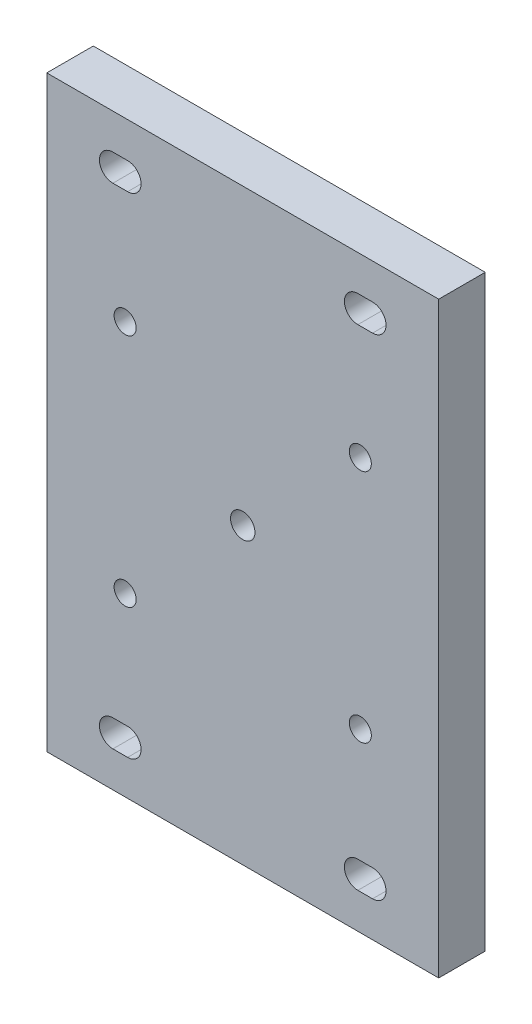
ISO-10303-21;
HEADER;
FILE_DESCRIPTION(('STEP AP214'),'2;1');
FILE_NAME('part.step','',(''),(''),'','','');
FILE_SCHEMA(('AUTOMOTIVE_DESIGN { 1 0 10303 214 1 1 1 1 }'));
ENDSEC;
DATA;
#1=APPLICATION_CONTEXT('core data for automotive mechanical design processes');
#2=APPLICATION_PROTOCOL_DEFINITION('international standard','automotive_design',2000,#1);
#3=PRODUCT_CONTEXT('',#1,'mechanical');
#4=PRODUCT('Part','Part','',(#3));
#5=PRODUCT_RELATED_PRODUCT_CATEGORY('part','',(#4));
#6=PRODUCT_DEFINITION_FORMATION('','',#4);
#7=PRODUCT_DEFINITION_CONTEXT('part definition',#1,'design');
#8=PRODUCT_DEFINITION('design','',#6,#7);
#9=PRODUCT_DEFINITION_SHAPE('','',#8);
#10=(LENGTH_UNIT() NAMED_UNIT(*) SI_UNIT(.MILLI.,.METRE.));
#11=(NAMED_UNIT(*) PLANE_ANGLE_UNIT() SI_UNIT($,.RADIAN.));
#12=(NAMED_UNIT(*) SI_UNIT($,.STERADIAN.) SOLID_ANGLE_UNIT());
#13=UNCERTAINTY_MEASURE_WITH_UNIT(LENGTH_MEASURE(1.E-05),#10,'distance_accuracy_value','');
#14=(GEOMETRIC_REPRESENTATION_CONTEXT(3) GLOBAL_UNCERTAINTY_ASSIGNED_CONTEXT((#13)) GLOBAL_UNIT_ASSIGNED_CONTEXT((#10,
#11,#12)) REPRESENTATION_CONTEXT('',''));
#15=CARTESIAN_POINT('',(0.,0.,0.));
#16=DIRECTION('',(0.,0.,1.));
#17=DIRECTION('',(1.,0.,0.));
#18=AXIS2_PLACEMENT_3D('',#15,#16,#17);
#19=CARTESIAN_POINT('',(24.,-24.,0.));
#20=DIRECTION('',(0.,0.,-1.));
#21=DIRECTION('',(-1.,0.,0.));
#22=AXIS2_PLACEMENT_3D('',#19,#20,#21);
#23=CYLINDRICAL_SURFACE('',#22,4.);
#24=CARTESIAN_POINT('',(24.,-24.,4.4));
#25=DIRECTION('',(0.,0.,-1.));
#26=DIRECTION('',(-1.,0.,0.));
#27=AXIS2_PLACEMENT_3D('',#24,#25,#26);
#28=CIRCLE('',#27,4.);
#29=CARTESIAN_POINT('',(20.,-24.,4.4));
#30=VERTEX_POINT('',#29);
#31=EDGE_CURVE('E19',#30,#30,#28,.F.);
#32=ORIENTED_EDGE('',*,*,#31,.T.);
#33=EDGE_LOOP('',(#32));
#34=FACE_BOUND('',#33,.T.);
#35=CARTESIAN_POINT('',(24.,-24.,0.));
#36=DIRECTION('',(0.,0.,-1.));
#37=DIRECTION('',(-1.,0.,0.));
#38=AXIS2_PLACEMENT_3D('',#35,#36,#37);
#39=CIRCLE('',#38,4.);
#40=CARTESIAN_POINT('',(20.,-24.,0.));
#41=VERTEX_POINT('',#40);
#42=EDGE_CURVE('E286',#41,#41,#39,.T.);
#43=ORIENTED_EDGE('',*,*,#42,.T.);
#44=EDGE_LOOP('',(#43));
#45=FACE_BOUND('',#44,.T.);
#46=ADVANCED_FACE('F16',(#34,#45),#23,.F.);
#47=CARTESIAN_POINT('',(-24.,-24.,0.));
#48=DIRECTION('',(0.,0.,-1.));
#49=DIRECTION('',(-1.,0.,0.));
#50=AXIS2_PLACEMENT_3D('',#47,#48,#49);
#51=CYLINDRICAL_SURFACE('',#50,4.);
#52=CARTESIAN_POINT('',(-24.,-24.,4.4));
#53=DIRECTION('',(0.,0.,-1.));
#54=DIRECTION('',(-1.,0.,0.));
#55=AXIS2_PLACEMENT_3D('',#52,#53,#54);
#56=CIRCLE('',#55,4.);
#57=CARTESIAN_POINT('',(-28.,-24.,4.4));
#58=VERTEX_POINT('',#57);
#59=EDGE_CURVE('E294',#58,#58,#56,.F.);
#60=ORIENTED_EDGE('',*,*,#59,.T.);
#61=EDGE_LOOP('',(#60));
#62=FACE_BOUND('',#61,.T.);
#63=CARTESIAN_POINT('',(-24.,-24.,0.));
#64=DIRECTION('',(0.,0.,-1.));
#65=DIRECTION('',(-1.,0.,0.));
#66=AXIS2_PLACEMENT_3D('',#63,#64,#65);
#67=CIRCLE('',#66,4.);
#68=CARTESIAN_POINT('',(-28.,-24.,0.));
#69=VERTEX_POINT('',#68);
#70=EDGE_CURVE('E283',#69,#69,#67,.T.);
#71=ORIENTED_EDGE('',*,*,#70,.T.);
#72=EDGE_LOOP('',(#71));
#73=FACE_BOUND('',#72,.T.);
#74=ADVANCED_FACE('F516',(#62,#73),#51,.F.);
#75=CARTESIAN_POINT('',(24.,24.,0.));
#76=DIRECTION('',(0.,0.,-1.));
#77=DIRECTION('',(-1.,0.,0.));
#78=AXIS2_PLACEMENT_3D('',#75,#76,#77);
#79=CYLINDRICAL_SURFACE('',#78,4.);
#80=CARTESIAN_POINT('',(24.,24.,4.4));
#81=DIRECTION('',(0.,0.,-1.));
#82=DIRECTION('',(-1.,0.,0.));
#83=AXIS2_PLACEMENT_3D('',#80,#81,#82);
#84=CIRCLE('',#83,4.);
#85=CARTESIAN_POINT('',(20.,24.,4.4));
#86=VERTEX_POINT('',#85);
#87=EDGE_CURVE('E292',#86,#86,#84,.F.);
#88=ORIENTED_EDGE('',*,*,#87,.T.);
#89=EDGE_LOOP('',(#88));
#90=FACE_BOUND('',#89,.T.);
#91=CARTESIAN_POINT('',(24.,24.,0.));
#92=DIRECTION('',(0.,0.,-1.));
#93=DIRECTION('',(-1.,0.,0.));
#94=AXIS2_PLACEMENT_3D('',#91,#92,#93);
#95=CIRCLE('',#94,4.);
#96=CARTESIAN_POINT('',(20.,24.,0.));
#97=VERTEX_POINT('',#96);
#98=EDGE_CURVE('E280',#97,#97,#95,.T.);
#99=ORIENTED_EDGE('',*,*,#98,.T.);
#100=EDGE_LOOP('',(#99));
#101=FACE_BOUND('',#100,.T.);
#102=ADVANCED_FACE('F513',(#90,#101),#79,.F.);
#103=CARTESIAN_POINT('',(-24.,24.,0.));
#104=DIRECTION('',(0.,0.,-1.));
#105=DIRECTION('',(-1.,0.,0.));
#106=AXIS2_PLACEMENT_3D('',#103,#104,#105);
#107=CYLINDRICAL_SURFACE('',#106,4.);
#108=CARTESIAN_POINT('',(-24.,24.,4.4));
#109=DIRECTION('',(0.,0.,-1.));
#110=DIRECTION('',(-1.,0.,0.));
#111=AXIS2_PLACEMENT_3D('',#108,#109,#110);
#112=CIRCLE('',#111,4.);
#113=CARTESIAN_POINT('',(-28.,24.,4.4));
#114=VERTEX_POINT('',#113);
#115=EDGE_CURVE('E289',#114,#114,#112,.F.);
#116=ORIENTED_EDGE('',*,*,#115,.T.);
#117=EDGE_LOOP('',(#116));
#118=FACE_BOUND('',#117,.T.);
#119=CARTESIAN_POINT('',(-24.,24.,0.));
#120=DIRECTION('',(0.,0.,-1.));
#121=DIRECTION('',(-1.,0.,0.));
#122=AXIS2_PLACEMENT_3D('',#119,#120,#121);
#123=CIRCLE('',#122,4.);
#124=CARTESIAN_POINT('',(-28.,24.,0.));
#125=VERTEX_POINT('',#124);
#126=EDGE_CURVE('E168',#125,#125,#123,.T.);
#127=ORIENTED_EDGE('',*,*,#126,.T.);
#128=EDGE_LOOP('',(#127));
#129=FACE_BOUND('',#128,.T.);
#130=ADVANCED_FACE('F307',(#118,#129),#107,.F.);
#131=CARTESIAN_POINT('',(26.25,-24.,4.4));
#132=DIRECTION('',(0.,0.,1.));
#133=DIRECTION('',(1.,0.,0.));
#134=AXIS2_PLACEMENT_3D('',#131,#132,#133);
#135=PLANE('',#134);
#136=ORIENTED_EDGE('',*,*,#31,.F.);
#137=EDGE_LOOP('',(#136));
#138=FACE_BOUND('',#137,.T.);
#139=CARTESIAN_POINT('',(24.,-24.,4.4));
#140=DIRECTION('',(0.,0.,-1.));
#141=DIRECTION('',(-1.,0.,0.));
#142=AXIS2_PLACEMENT_3D('',#139,#140,#141);
#143=CIRCLE('',#142,2.25);
#144=CARTESIAN_POINT('',(21.75,-24.,4.4));
#145=VERTEX_POINT('',#144);
#146=EDGE_CURVE('E262',#145,#145,#143,.F.);
#147=ORIENTED_EDGE('',*,*,#146,.T.);
#148=EDGE_LOOP('',(#147));
#149=FACE_BOUND('',#148,.T.);
#150=ADVANCED_FACE('F303',(#138,#149),#135,.F.);
#151=CARTESIAN_POINT('',(-21.75,-24.,4.4));
#152=DIRECTION('',(0.,0.,1.));
#153=DIRECTION('',(1.,0.,0.));
#154=AXIS2_PLACEMENT_3D('',#151,#152,#153);
#155=PLANE('',#154);
#156=ORIENTED_EDGE('',*,*,#59,.F.);
#157=EDGE_LOOP('',(#156));
#158=FACE_BOUND('',#157,.T.);
#159=CARTESIAN_POINT('',(-24.,-24.,4.4));
#160=DIRECTION('',(0.,0.,-1.));
#161=DIRECTION('',(-1.,0.,0.));
#162=AXIS2_PLACEMENT_3D('',#159,#160,#161);
#163=CIRCLE('',#162,2.25);
#164=CARTESIAN_POINT('',(-26.25,-24.,4.4));
#165=VERTEX_POINT('',#164);
#166=EDGE_CURVE('E259',#165,#165,#163,.F.);
#167=ORIENTED_EDGE('',*,*,#166,.T.);
#168=EDGE_LOOP('',(#167));
#169=FACE_BOUND('',#168,.T.);
#170=ADVANCED_FACE('F306',(#158,#169),#155,.F.);
#171=CARTESIAN_POINT('',(26.25,24.,4.4));
#172=DIRECTION('',(0.,0.,1.));
#173=DIRECTION('',(1.,0.,0.));
#174=AXIS2_PLACEMENT_3D('',#171,#172,#173);
#175=PLANE('',#174);
#176=ORIENTED_EDGE('',*,*,#87,.F.);
#177=EDGE_LOOP('',(#176));
#178=FACE_BOUND('',#177,.T.);
#179=CARTESIAN_POINT('',(24.,24.,4.4));
#180=DIRECTION('',(0.,0.,-1.));
#181=DIRECTION('',(-1.,0.,0.));
#182=AXIS2_PLACEMENT_3D('',#179,#180,#181);
#183=CIRCLE('',#182,2.25);
#184=CARTESIAN_POINT('',(21.75,24.,4.4));
#185=VERTEX_POINT('',#184);
#186=EDGE_CURVE('E256',#185,#185,#183,.F.);
#187=ORIENTED_EDGE('',*,*,#186,.T.);
#188=EDGE_LOOP('',(#187));
#189=FACE_BOUND('',#188,.T.);
#190=ADVANCED_FACE('F503',(#178,#189),#175,.F.);
#191=CARTESIAN_POINT('',(-21.75,24.,4.4));
#192=DIRECTION('',(0.,0.,1.));
#193=DIRECTION('',(1.,0.,0.));
#194=AXIS2_PLACEMENT_3D('',#191,#192,#193);
#195=PLANE('',#194);
#196=ORIENTED_EDGE('',*,*,#115,.F.);
#197=EDGE_LOOP('',(#196));
#198=FACE_BOUND('',#197,.T.);
#199=CARTESIAN_POINT('',(-24.,24.,4.4));
#200=DIRECTION('',(0.,0.,-1.));
#201=DIRECTION('',(-1.,0.,0.));
#202=AXIS2_PLACEMENT_3D('',#199,#200,#201);
#203=CIRCLE('',#202,2.25);
#204=CARTESIAN_POINT('',(-26.25,24.,4.4));
#205=VERTEX_POINT('',#204);
#206=EDGE_CURVE('E253',#205,#205,#203,.F.);
#207=ORIENTED_EDGE('',*,*,#206,.T.);
#208=EDGE_LOOP('',(#207));
#209=FACE_BOUND('',#208,.T.);
#210=ADVANCED_FACE('F500',(#198,#209),#195,.F.);
#211=CARTESIAN_POINT('',(-40.,-60.,0.));
#212=DIRECTION('',(0.,0.,1.));
#213=DIRECTION('',(1.,0.,0.));
#214=AXIS2_PLACEMENT_3D('',#211,#212,#213);
#215=PLANE('',#214);
#216=DIRECTION('',(1.,0.,0.));
#217=VECTOR('',#216,1.);
#218=CARTESIAN_POINT('',(40.,60.,0.));
#219=LINE('',#218,#217);
#220=CARTESIAN_POINT('',(-40.,60.,0.));
#221=VERTEX_POINT('',#220);
#222=CARTESIAN_POINT('',(40.,60.,0.));
#223=VERTEX_POINT('',#222);
#224=EDGE_CURVE('E248',#221,#223,#219,.T.);
#225=ORIENTED_EDGE('',*,*,#224,.T.);
#226=DIRECTION('',(0.,1.,0.));
#227=VECTOR('',#226,1.);
#228=CARTESIAN_POINT('',(40.,-60.,0.));
#229=LINE('',#228,#227);
#230=CARTESIAN_POINT('',(40.,-60.,0.));
#231=VERTEX_POINT('',#230);
#232=EDGE_CURVE('E361',#223,#231,#229,.F.);
#233=ORIENTED_EDGE('',*,*,#232,.T.);
#234=DIRECTION('',(1.,0.,0.));
#235=VECTOR('',#234,1.);
#236=CARTESIAN_POINT('',(-40.,-60.,0.));
#237=LINE('',#236,#235);
#238=CARTESIAN_POINT('',(-40.,-60.,0.));
#239=VERTEX_POINT('',#238);
#240=EDGE_CURVE('E366',#231,#239,#237,.F.);
#241=ORIENTED_EDGE('',*,*,#240,.T.);
#242=DIRECTION('',(0.,1.,0.));
#243=VECTOR('',#242,1.);
#244=CARTESIAN_POINT('',(-40.,60.,0.));
#245=LINE('',#244,#243);
#246=EDGE_CURVE('E252',#239,#221,#245,.T.);
#247=ORIENTED_EDGE('',*,*,#246,.T.);
#248=EDGE_LOOP('',(#225,#233,#241,#247));
#249=FACE_BOUND('',#248,.T.);
#250=CARTESIAN_POINT('',(0.,0.,0.));
#251=DIRECTION('',(0.,0.,-1.));
#252=DIRECTION('',(-1.,0.,0.));
#253=AXIS2_PLACEMENT_3D('',#250,#251,#252);
#254=CIRCLE('',#253,2.495);
#255=CARTESIAN_POINT('',(-2.495,0.,0.));
#256=VERTEX_POINT('',#255);
#257=EDGE_CURVE('E249',#256,#256,#254,.F.);
#258=ORIENTED_EDGE('',*,*,#257,.T.);
#259=EDGE_LOOP('',(#258));
#260=FACE_BOUND('',#259,.T.);
#261=ORIENTED_EDGE('',*,*,#126,.F.);
#262=EDGE_LOOP('',(#261));
#263=FACE_BOUND('',#262,.T.);
#264=ORIENTED_EDGE('',*,*,#98,.F.);
#265=EDGE_LOOP('',(#264));
#266=FACE_BOUND('',#265,.T.);
#267=ORIENTED_EDGE('',*,*,#70,.F.);
#268=EDGE_LOOP('',(#267));
#269=FACE_BOUND('',#268,.T.);
#270=ORIENTED_EDGE('',*,*,#42,.F.);
#271=EDGE_LOOP('',(#270));
#272=FACE_BOUND('',#271,.T.);
#273=CARTESIAN_POINT('',(-26.5,50.,0.));
#274=DIRECTION('',(0.,0.,1.));
#275=DIRECTION('',(1.,0.,0.));
#276=AXIS2_PLACEMENT_3D('',#273,#274,#275);
#277=CIRCLE('',#276,2.75);
#278=CARTESIAN_POINT('',(-26.5,52.75,0.));
#279=VERTEX_POINT('',#278);
#280=CARTESIAN_POINT('',(-26.5,47.25,0.));
#281=VERTEX_POINT('',#280);
#282=EDGE_CURVE('E186',#279,#281,#277,.T.);
#283=ORIENTED_EDGE('',*,*,#282,.T.);
#284=DIRECTION('',(1.,0.,0.));
#285=VECTOR('',#284,1.);
#286=CARTESIAN_POINT('',(-26.5,47.25,0.));
#287=LINE('',#286,#285);
#288=CARTESIAN_POINT('',(-23.5,47.25,0.));
#289=VERTEX_POINT('',#288);
#290=EDGE_CURVE('E179',#281,#289,#287,.T.);
#291=ORIENTED_EDGE('',*,*,#290,.T.);
#292=CARTESIAN_POINT('',(-23.5,50.,0.));
#293=DIRECTION('',(0.,0.,1.));
#294=DIRECTION('',(1.,0.,0.));
#295=AXIS2_PLACEMENT_3D('',#292,#293,#294);
#296=CIRCLE('',#295,2.75);
#297=CARTESIAN_POINT('',(-23.5,52.75,0.));
#298=VERTEX_POINT('',#297);
#299=EDGE_CURVE('E265',#289,#298,#296,.T.);
#300=ORIENTED_EDGE('',*,*,#299,.T.);
#301=DIRECTION('',(1.,0.,0.));
#302=VECTOR('',#301,1.);
#303=CARTESIAN_POINT('',(-26.5,52.75,0.));
#304=LINE('',#303,#302);
#305=EDGE_CURVE('E183',#298,#279,#304,.F.);
#306=ORIENTED_EDGE('',*,*,#305,.T.);
#307=EDGE_LOOP('',(#283,#291,#300,#306));
#308=FACE_BOUND('',#307,.T.);
#309=CARTESIAN_POINT('',(23.5,50.,0.));
#310=DIRECTION('',(0.,0.,1.));
#311=DIRECTION('',(1.,0.,0.));
#312=AXIS2_PLACEMENT_3D('',#309,#310,#311);
#313=CIRCLE('',#312,2.75);
#314=CARTESIAN_POINT('',(23.5,52.75,0.));
#315=VERTEX_POINT('',#314);
#316=CARTESIAN_POINT('',(23.5,47.25,0.));
#317=VERTEX_POINT('',#316);
#318=EDGE_CURVE('E194',#315,#317,#313,.T.);
#319=ORIENTED_EDGE('',*,*,#318,.T.);
#320=DIRECTION('',(1.,0.,0.));
#321=VECTOR('',#320,1.);
#322=CARTESIAN_POINT('',(23.5,47.25,0.));
#323=LINE('',#322,#321);
#324=CARTESIAN_POINT('',(26.5,47.25,0.));
#325=VERTEX_POINT('',#324);
#326=EDGE_CURVE('E187',#317,#325,#323,.T.);
#327=ORIENTED_EDGE('',*,*,#326,.T.);
#328=CARTESIAN_POINT('',(26.5,50.,0.));
#329=DIRECTION('',(0.,0.,1.));
#330=DIRECTION('',(1.,0.,0.));
#331=AXIS2_PLACEMENT_3D('',#328,#329,#330);
#332=CIRCLE('',#331,2.75);
#333=CARTESIAN_POINT('',(26.5,52.75,0.));
#334=VERTEX_POINT('',#333);
#335=EDGE_CURVE('E269',#325,#334,#332,.T.);
#336=ORIENTED_EDGE('',*,*,#335,.T.);
#337=DIRECTION('',(1.,0.,0.));
#338=VECTOR('',#337,1.);
#339=CARTESIAN_POINT('',(23.5,52.75,0.));
#340=LINE('',#339,#338);
#341=EDGE_CURVE('E191',#334,#315,#340,.F.);
#342=ORIENTED_EDGE('',*,*,#341,.T.);
#343=EDGE_LOOP('',(#319,#327,#336,#342));
#344=FACE_BOUND('',#343,.T.);
#345=CARTESIAN_POINT('',(-26.5,-50.,0.));
#346=DIRECTION('',(0.,0.,1.));
#347=DIRECTION('',(1.,0.,0.));
#348=AXIS2_PLACEMENT_3D('',#345,#346,#347);
#349=CIRCLE('',#348,2.75);
#350=CARTESIAN_POINT('',(-26.5,-47.25,0.));
#351=VERTEX_POINT('',#350);
#352=CARTESIAN_POINT('',(-26.5,-52.75,0.));
#353=VERTEX_POINT('',#352);
#354=EDGE_CURVE('E202',#351,#353,#349,.T.);
#355=ORIENTED_EDGE('',*,*,#354,.T.);
#356=DIRECTION('',(1.,0.,0.));
#357=VECTOR('',#356,1.);
#358=CARTESIAN_POINT('',(-26.5,-52.75,0.));
#359=LINE('',#358,#357);
#360=CARTESIAN_POINT('',(-23.5,-52.75,0.));
#361=VERTEX_POINT('',#360);
#362=EDGE_CURVE('E195',#353,#361,#359,.T.);
#363=ORIENTED_EDGE('',*,*,#362,.T.);
#364=CARTESIAN_POINT('',(-23.5,-50.,0.));
#365=DIRECTION('',(0.,0.,1.));
#366=DIRECTION('',(1.,0.,0.));
#367=AXIS2_PLACEMENT_3D('',#364,#365,#366);
#368=CIRCLE('',#367,2.75);
#369=CARTESIAN_POINT('',(-23.5,-47.25,0.));
#370=VERTEX_POINT('',#369);
#371=EDGE_CURVE('E273',#361,#370,#368,.T.);
#372=ORIENTED_EDGE('',*,*,#371,.T.);
#373=DIRECTION('',(1.,0.,0.));
#374=VECTOR('',#373,1.);
#375=CARTESIAN_POINT('',(-26.5,-47.25,0.));
#376=LINE('',#375,#374);
#377=EDGE_CURVE('E199',#370,#351,#376,.F.);
#378=ORIENTED_EDGE('',*,*,#377,.T.);
#379=EDGE_LOOP('',(#355,#363,#372,#378));
#380=FACE_BOUND('',#379,.T.);
#381=CARTESIAN_POINT('',(23.5,-50.,0.));
#382=DIRECTION('',(0.,0.,1.));
#383=DIRECTION('',(1.,0.,0.));
#384=AXIS2_PLACEMENT_3D('',#381,#382,#383);
#385=CIRCLE('',#384,2.75);
#386=CARTESIAN_POINT('',(23.5,-47.25,0.));
#387=VERTEX_POINT('',#386);
#388=CARTESIAN_POINT('',(23.5,-52.75,0.));
#389=VERTEX_POINT('',#388);
#390=EDGE_CURVE('E153',#387,#389,#385,.T.);
#391=ORIENTED_EDGE('',*,*,#390,.T.);
#392=DIRECTION('',(1.,0.,0.));
#393=VECTOR('',#392,1.);
#394=CARTESIAN_POINT('',(23.5,-52.75,0.));
#395=LINE('',#394,#393);
#396=CARTESIAN_POINT('',(26.5,-52.75,0.));
#397=VERTEX_POINT('',#396);
#398=EDGE_CURVE('E203',#389,#397,#395,.T.);
#399=ORIENTED_EDGE('',*,*,#398,.T.);
#400=CARTESIAN_POINT('',(26.5,-50.,0.));
#401=DIRECTION('',(0.,0.,1.));
#402=DIRECTION('',(1.,0.,0.));
#403=AXIS2_PLACEMENT_3D('',#400,#401,#402);
#404=CIRCLE('',#403,2.75);
#405=CARTESIAN_POINT('',(26.5,-47.25,0.));
#406=VERTEX_POINT('',#405);
#407=EDGE_CURVE('E156',#397,#406,#404,.T.);
#408=ORIENTED_EDGE('',*,*,#407,.T.);
#409=DIRECTION('',(1.,0.,0.));
#410=VECTOR('',#409,1.);
#411=CARTESIAN_POINT('',(23.5,-47.25,0.));
#412=LINE('',#411,#410);
#413=EDGE_CURVE('E150',#406,#387,#412,.F.);
#414=ORIENTED_EDGE('',*,*,#413,.T.);
#415=EDGE_LOOP('',(#391,#399,#408,#414));
#416=FACE_BOUND('',#415,.T.);
#417=ADVANCED_FACE('F152',(#249,#260,#263,#266,#269,#272,#308,#344,#380,#416),#215,.F.);
#418=CARTESIAN_POINT('',(23.5,-50.,0.));
#419=DIRECTION('',(0.,0.,1.));
#420=DIRECTION('',(1.,0.,0.));
#421=AXIS2_PLACEMENT_3D('',#418,#419,#420);
#422=CYLINDRICAL_SURFACE('',#421,2.75);
#423=DIRECTION('',(0.,0.,-1.));
#424=VECTOR('',#423,1.);
#425=CARTESIAN_POINT('',(23.5,-52.75,0.));
#426=LINE('',#425,#424);
#427=CARTESIAN_POINT('',(23.5,-52.75,9.5));
#428=VERTEX_POINT('',#427);
#429=EDGE_CURVE('E166',#428,#389,#426,.T.);
#430=ORIENTED_EDGE('',*,*,#429,.T.);
#431=ORIENTED_EDGE('',*,*,#390,.F.);
#432=DIRECTION('',(0.,0.,1.));
#433=VECTOR('',#432,1.);
#434=CARTESIAN_POINT('',(23.5,-47.25,0.));
#435=LINE('',#434,#433);
#436=CARTESIAN_POINT('',(23.5,-47.25,9.5));
#437=VERTEX_POINT('',#436);
#438=EDGE_CURVE('E160',#387,#437,#435,.T.);
#439=ORIENTED_EDGE('',*,*,#438,.T.);
#440=CARTESIAN_POINT('',(23.5,-50.,9.5));
#441=DIRECTION('',(0.,0.,1.));
#442=DIRECTION('',(1.,0.,0.));
#443=AXIS2_PLACEMENT_3D('',#440,#441,#442);
#444=CIRCLE('',#443,2.75);
#445=EDGE_CURVE('E246',#428,#437,#444,.F.);
#446=ORIENTED_EDGE('',*,*,#445,.F.);
#447=EDGE_LOOP('',(#430,#431,#439,#446));
#448=FACE_BOUND('',#447,.T.);
#449=ADVANCED_FACE('F163',(#448),#422,.F.);
#450=CARTESIAN_POINT('',(23.5,-47.25,0.));
#451=DIRECTION('',(0.,1.,0.));
#452=DIRECTION('',(0.,0.,1.));
#453=AXIS2_PLACEMENT_3D('',#450,#451,#452);
#454=PLANE('',#453);
#455=ORIENTED_EDGE('',*,*,#438,.F.);
#456=ORIENTED_EDGE('',*,*,#413,.F.);
#457=DIRECTION('',(0.,0.,1.));
#458=VECTOR('',#457,1.);
#459=CARTESIAN_POINT('',(26.5,-47.25,0.));
#460=LINE('',#459,#458);
#461=CARTESIAN_POINT('',(26.5,-47.25,9.5));
#462=VERTEX_POINT('',#461);
#463=EDGE_CURVE('E174',#406,#462,#460,.T.);
#464=ORIENTED_EDGE('',*,*,#463,.T.);
#465=DIRECTION('',(1.,0.,0.));
#466=VECTOR('',#465,1.);
#467=CARTESIAN_POINT('',(-40.,-47.25,9.5));
#468=LINE('',#467,#466);
#469=EDGE_CURVE('E172',#437,#462,#468,.T.);
#470=ORIENTED_EDGE('',*,*,#469,.F.);
#471=EDGE_LOOP('',(#455,#456,#464,#470));
#472=FACE_BOUND('',#471,.T.);
#473=ADVANCED_FACE('F170',(#472),#454,.F.);
#474=CARTESIAN_POINT('',(26.5,-50.,0.));
#475=DIRECTION('',(0.,0.,1.));
#476=DIRECTION('',(1.,0.,0.));
#477=AXIS2_PLACEMENT_3D('',#474,#475,#476);
#478=CYLINDRICAL_SURFACE('',#477,2.75);
#479=ORIENTED_EDGE('',*,*,#407,.F.);
#480=DIRECTION('',(0.,0.,-1.));
#481=VECTOR('',#480,1.);
#482=CARTESIAN_POINT('',(26.5,-52.75,0.));
#483=LINE('',#482,#481);
#484=CARTESIAN_POINT('',(26.5,-52.75,9.5));
#485=VERTEX_POINT('',#484);
#486=EDGE_CURVE('E204',#397,#485,#483,.F.);
#487=ORIENTED_EDGE('',*,*,#486,.T.);
#488=CARTESIAN_POINT('',(26.5,-50.,9.5));
#489=DIRECTION('',(0.,0.,1.));
#490=DIRECTION('',(1.,0.,0.));
#491=AXIS2_PLACEMENT_3D('',#488,#489,#490);
#492=CIRCLE('',#491,2.75);
#493=EDGE_CURVE('E244',#462,#485,#492,.F.);
#494=ORIENTED_EDGE('',*,*,#493,.F.);
#495=ORIENTED_EDGE('',*,*,#463,.F.);
#496=EDGE_LOOP('',(#479,#487,#494,#495));
#497=FACE_BOUND('',#496,.T.);
#498=ADVANCED_FACE('F346',(#497),#478,.F.);
#499=CARTESIAN_POINT('',(23.5,-52.75,0.));
#500=DIRECTION('',(0.,-1.,0.));
#501=DIRECTION('',(0.,0.,-1.));
#502=AXIS2_PLACEMENT_3D('',#499,#500,#501);
#503=PLANE('',#502);
#504=ORIENTED_EDGE('',*,*,#486,.F.);
#505=ORIENTED_EDGE('',*,*,#398,.F.);
#506=ORIENTED_EDGE('',*,*,#429,.F.);
#507=DIRECTION('',(1.,0.,0.));
#508=VECTOR('',#507,1.);
#509=CARTESIAN_POINT('',(-40.,-52.75,9.5));
#510=LINE('',#509,#508);
#511=EDGE_CURVE('E243',#485,#428,#510,.F.);
#512=ORIENTED_EDGE('',*,*,#511,.F.);
#513=EDGE_LOOP('',(#504,#505,#506,#512));
#514=FACE_BOUND('',#513,.T.);
#515=ADVANCED_FACE('F349',(#514),#503,.F.);
#516=CARTESIAN_POINT('',(-26.5,-50.,0.));
#517=DIRECTION('',(0.,0.,1.));
#518=DIRECTION('',(1.,0.,0.));
#519=AXIS2_PLACEMENT_3D('',#516,#517,#518);
#520=CYLINDRICAL_SURFACE('',#519,2.75);
#521=DIRECTION('',(0.,0.,-1.));
#522=VECTOR('',#521,1.);
#523=CARTESIAN_POINT('',(-26.5,-52.75,0.));
#524=LINE('',#523,#522);
#525=CARTESIAN_POINT('',(-26.5,-52.75,9.5));
#526=VERTEX_POINT('',#525);
#527=EDGE_CURVE('E198',#526,#353,#524,.T.);
#528=ORIENTED_EDGE('',*,*,#527,.T.);
#529=ORIENTED_EDGE('',*,*,#354,.F.);
#530=DIRECTION('',(0.,0.,1.));
#531=VECTOR('',#530,1.);
#532=CARTESIAN_POINT('',(-26.5,-47.25,0.));
#533=LINE('',#532,#531);
#534=CARTESIAN_POINT('',(-26.5,-47.25,9.5));
#535=VERTEX_POINT('',#534);
#536=EDGE_CURVE('E201',#351,#535,#533,.T.);
#537=ORIENTED_EDGE('',*,*,#536,.T.);
#538=CARTESIAN_POINT('',(-26.5,-50.,9.5));
#539=DIRECTION('',(0.,0.,1.));
#540=DIRECTION('',(1.,0.,0.));
#541=AXIS2_PLACEMENT_3D('',#538,#539,#540);
#542=CIRCLE('',#541,2.75);
#543=EDGE_CURVE('E240',#526,#535,#542,.F.);
#544=ORIENTED_EDGE('',*,*,#543,.F.);
#545=EDGE_LOOP('',(#528,#529,#537,#544));
#546=FACE_BOUND('',#545,.T.);
#547=ADVANCED_FACE('F390',(#546),#520,.F.);
#548=CARTESIAN_POINT('',(-26.5,-47.25,0.));
#549=DIRECTION('',(0.,1.,0.));
#550=DIRECTION('',(0.,0.,1.));
#551=AXIS2_PLACEMENT_3D('',#548,#549,#550);
#552=PLANE('',#551);
#553=ORIENTED_EDGE('',*,*,#536,.F.);
#554=ORIENTED_EDGE('',*,*,#377,.F.);
#555=DIRECTION('',(0.,0.,1.));
#556=VECTOR('',#555,1.);
#557=CARTESIAN_POINT('',(-23.5,-47.25,0.));
#558=LINE('',#557,#556);
#559=CARTESIAN_POINT('',(-23.5,-47.25,9.5));
#560=VERTEX_POINT('',#559);
#561=EDGE_CURVE('E275',#370,#560,#558,.T.);
#562=ORIENTED_EDGE('',*,*,#561,.T.);
#563=DIRECTION('',(1.,0.,0.));
#564=VECTOR('',#563,1.);
#565=CARTESIAN_POINT('',(-40.,-47.25,9.5));
#566=LINE('',#565,#564);
#567=EDGE_CURVE('E239',#535,#560,#566,.T.);
#568=ORIENTED_EDGE('',*,*,#567,.F.);
#569=EDGE_LOOP('',(#553,#554,#562,#568));
#570=FACE_BOUND('',#569,.T.);
#571=ADVANCED_FACE('F394',(#570),#552,.F.);
#572=CARTESIAN_POINT('',(-23.5,-50.,0.));
#573=DIRECTION('',(0.,0.,1.));
#574=DIRECTION('',(1.,0.,0.));
#575=AXIS2_PLACEMENT_3D('',#572,#573,#574);
#576=CYLINDRICAL_SURFACE('',#575,2.75);
#577=ORIENTED_EDGE('',*,*,#371,.F.);
#578=DIRECTION('',(0.,0.,-1.));
#579=VECTOR('',#578,1.);
#580=CARTESIAN_POINT('',(-23.5,-52.75,0.));
#581=LINE('',#580,#579);
#582=CARTESIAN_POINT('',(-23.5,-52.75,9.5));
#583=VERTEX_POINT('',#582);
#584=EDGE_CURVE('E197',#361,#583,#581,.F.);
#585=ORIENTED_EDGE('',*,*,#584,.T.);
#586=CARTESIAN_POINT('',(-23.5,-50.,9.5));
#587=DIRECTION('',(0.,0.,1.));
#588=DIRECTION('',(1.,0.,0.));
#589=AXIS2_PLACEMENT_3D('',#586,#587,#588);
#590=CIRCLE('',#589,2.75);
#591=EDGE_CURVE('E237',#560,#583,#590,.F.);
#592=ORIENTED_EDGE('',*,*,#591,.F.);
#593=ORIENTED_EDGE('',*,*,#561,.F.);
#594=EDGE_LOOP('',(#577,#585,#592,#593));
#595=FACE_BOUND('',#594,.T.);
#596=ADVANCED_FACE('F482',(#595),#576,.F.);
#597=CARTESIAN_POINT('',(-26.5,-52.75,0.));
#598=DIRECTION('',(0.,-1.,0.));
#599=DIRECTION('',(0.,0.,-1.));
#600=AXIS2_PLACEMENT_3D('',#597,#598,#599);
#601=PLANE('',#600);
#602=ORIENTED_EDGE('',*,*,#584,.F.);
#603=ORIENTED_EDGE('',*,*,#362,.F.);
#604=ORIENTED_EDGE('',*,*,#527,.F.);
#605=DIRECTION('',(1.,0.,0.));
#606=VECTOR('',#605,1.);
#607=CARTESIAN_POINT('',(-40.,-52.75,9.5));
#608=LINE('',#607,#606);
#609=EDGE_CURVE('E236',#583,#526,#608,.F.);
#610=ORIENTED_EDGE('',*,*,#609,.F.);
#611=EDGE_LOOP('',(#602,#603,#604,#610));
#612=FACE_BOUND('',#611,.T.);
#613=ADVANCED_FACE('F478',(#612),#601,.F.);
#614=CARTESIAN_POINT('',(23.5,50.,0.));
#615=DIRECTION('',(0.,0.,1.));
#616=DIRECTION('',(1.,0.,0.));
#617=AXIS2_PLACEMENT_3D('',#614,#615,#616);
#618=CYLINDRICAL_SURFACE('',#617,2.75);
#619=DIRECTION('',(0.,0.,-1.));
#620=VECTOR('',#619,1.);
#621=CARTESIAN_POINT('',(23.5,47.25,0.));
#622=LINE('',#621,#620);
#623=CARTESIAN_POINT('',(23.5,47.25,9.5));
#624=VERTEX_POINT('',#623);
#625=EDGE_CURVE('E190',#624,#317,#622,.T.);
#626=ORIENTED_EDGE('',*,*,#625,.T.);
#627=ORIENTED_EDGE('',*,*,#318,.F.);
#628=DIRECTION('',(0.,0.,1.));
#629=VECTOR('',#628,1.);
#630=CARTESIAN_POINT('',(23.5,52.75,0.));
#631=LINE('',#630,#629);
#632=CARTESIAN_POINT('',(23.5,52.75,9.5));
#633=VERTEX_POINT('',#632);
#634=EDGE_CURVE('E193',#315,#633,#631,.T.);
#635=ORIENTED_EDGE('',*,*,#634,.T.);
#636=CARTESIAN_POINT('',(23.5,50.,9.5));
#637=DIRECTION('',(0.,0.,1.));
#638=DIRECTION('',(1.,0.,0.));
#639=AXIS2_PLACEMENT_3D('',#636,#637,#638);
#640=CIRCLE('',#639,2.75);
#641=EDGE_CURVE('E233',#624,#633,#640,.F.);
#642=ORIENTED_EDGE('',*,*,#641,.F.);
#643=EDGE_LOOP('',(#626,#627,#635,#642));
#644=FACE_BOUND('',#643,.T.);
#645=ADVANCED_FACE('F474',(#644),#618,.F.);
#646=CARTESIAN_POINT('',(23.5,52.75,0.));
#647=DIRECTION('',(0.,1.,0.));
#648=DIRECTION('',(0.,0.,1.));
#649=AXIS2_PLACEMENT_3D('',#646,#647,#648);
#650=PLANE('',#649);
#651=ORIENTED_EDGE('',*,*,#634,.F.);
#652=ORIENTED_EDGE('',*,*,#341,.F.);
#653=DIRECTION('',(0.,0.,1.));
#654=VECTOR('',#653,1.);
#655=CARTESIAN_POINT('',(26.5,52.75,0.));
#656=LINE('',#655,#654);
#657=CARTESIAN_POINT('',(26.5,52.75,9.5));
#658=VERTEX_POINT('',#657);
#659=EDGE_CURVE('E271',#334,#658,#656,.T.);
#660=ORIENTED_EDGE('',*,*,#659,.T.);
#661=DIRECTION('',(1.,0.,0.));
#662=VECTOR('',#661,1.);
#663=CARTESIAN_POINT('',(-40.,52.75,9.5));
#664=LINE('',#663,#662);
#665=EDGE_CURVE('E232',#633,#658,#664,.T.);
#666=ORIENTED_EDGE('',*,*,#665,.F.);
#667=EDGE_LOOP('',(#651,#652,#660,#666));
#668=FACE_BOUND('',#667,.T.);
#669=ADVANCED_FACE('F470',(#668),#650,.F.);
#670=CARTESIAN_POINT('',(26.5,50.,0.));
#671=DIRECTION('',(0.,0.,1.));
#672=DIRECTION('',(1.,0.,0.));
#673=AXIS2_PLACEMENT_3D('',#670,#671,#672);
#674=CYLINDRICAL_SURFACE('',#673,2.75);
#675=ORIENTED_EDGE('',*,*,#335,.F.);
#676=DIRECTION('',(0.,0.,-1.));
#677=VECTOR('',#676,1.);
#678=CARTESIAN_POINT('',(26.5,47.25,0.));
#679=LINE('',#678,#677);
#680=CARTESIAN_POINT('',(26.5,47.25,9.5));
#681=VERTEX_POINT('',#680);
#682=EDGE_CURVE('E189',#325,#681,#679,.F.);
#683=ORIENTED_EDGE('',*,*,#682,.T.);
#684=CARTESIAN_POINT('',(26.5,50.,9.5));
#685=DIRECTION('',(0.,0.,1.));
#686=DIRECTION('',(1.,0.,0.));
#687=AXIS2_PLACEMENT_3D('',#684,#685,#686);
#688=CIRCLE('',#687,2.75);
#689=EDGE_CURVE('E230',#658,#681,#688,.F.);
#690=ORIENTED_EDGE('',*,*,#689,.F.);
#691=ORIENTED_EDGE('',*,*,#659,.F.);
#692=EDGE_LOOP('',(#675,#683,#690,#691));
#693=FACE_BOUND('',#692,.T.);
#694=ADVANCED_FACE('F466',(#693),#674,.F.);
#695=CARTESIAN_POINT('',(23.5,47.25,0.));
#696=DIRECTION('',(0.,-1.,0.));
#697=DIRECTION('',(0.,0.,-1.));
#698=AXIS2_PLACEMENT_3D('',#695,#696,#697);
#699=PLANE('',#698);
#700=ORIENTED_EDGE('',*,*,#682,.F.);
#701=ORIENTED_EDGE('',*,*,#326,.F.);
#702=ORIENTED_EDGE('',*,*,#625,.F.);
#703=DIRECTION('',(1.,0.,0.));
#704=VECTOR('',#703,1.);
#705=CARTESIAN_POINT('',(-40.,47.25,9.5));
#706=LINE('',#705,#704);
#707=EDGE_CURVE('E229',#681,#624,#706,.F.);
#708=ORIENTED_EDGE('',*,*,#707,.F.);
#709=EDGE_LOOP('',(#700,#701,#702,#708));
#710=FACE_BOUND('',#709,.T.);
#711=ADVANCED_FACE('F462',(#710),#699,.F.);
#712=CARTESIAN_POINT('',(-26.5,50.,0.));
#713=DIRECTION('',(0.,0.,1.));
#714=DIRECTION('',(1.,0.,0.));
#715=AXIS2_PLACEMENT_3D('',#712,#713,#714);
#716=CYLINDRICAL_SURFACE('',#715,2.75);
#717=DIRECTION('',(0.,0.,-1.));
#718=VECTOR('',#717,1.);
#719=CARTESIAN_POINT('',(-26.5,47.25,0.));
#720=LINE('',#719,#718);
#721=CARTESIAN_POINT('',(-26.5,47.25,9.5));
#722=VERTEX_POINT('',#721);
#723=EDGE_CURVE('E182',#722,#281,#720,.T.);
#724=ORIENTED_EDGE('',*,*,#723,.T.);
#725=ORIENTED_EDGE('',*,*,#282,.F.);
#726=DIRECTION('',(0.,0.,1.));
#727=VECTOR('',#726,1.);
#728=CARTESIAN_POINT('',(-26.5,52.75,0.));
#729=LINE('',#728,#727);
#730=CARTESIAN_POINT('',(-26.5,52.75,9.5));
#731=VERTEX_POINT('',#730);
#732=EDGE_CURVE('E185',#279,#731,#729,.T.);
#733=ORIENTED_EDGE('',*,*,#732,.T.);
#734=CARTESIAN_POINT('',(-26.5,50.,9.5));
#735=DIRECTION('',(0.,0.,1.));
#736=DIRECTION('',(1.,0.,0.));
#737=AXIS2_PLACEMENT_3D('',#734,#735,#736);
#738=CIRCLE('',#737,2.75);
#739=EDGE_CURVE('E226',#722,#731,#738,.F.);
#740=ORIENTED_EDGE('',*,*,#739,.F.);
#741=EDGE_LOOP('',(#724,#725,#733,#740));
#742=FACE_BOUND('',#741,.T.);
#743=ADVANCED_FACE('F458',(#742),#716,.F.);
#744=CARTESIAN_POINT('',(-26.5,52.75,0.));
#745=DIRECTION('',(0.,1.,0.));
#746=DIRECTION('',(0.,0.,1.));
#747=AXIS2_PLACEMENT_3D('',#744,#745,#746);
#748=PLANE('',#747);
#749=ORIENTED_EDGE('',*,*,#732,.F.);
#750=ORIENTED_EDGE('',*,*,#305,.F.);
#751=DIRECTION('',(0.,0.,1.));
#752=VECTOR('',#751,1.);
#753=CARTESIAN_POINT('',(-23.5,52.75,0.));
#754=LINE('',#753,#752);
#755=CARTESIAN_POINT('',(-23.5,52.75,9.5));
#756=VERTEX_POINT('',#755);
#757=EDGE_CURVE('E267',#298,#756,#754,.T.);
#758=ORIENTED_EDGE('',*,*,#757,.T.);
#759=DIRECTION('',(1.,0.,0.));
#760=VECTOR('',#759,1.);
#761=CARTESIAN_POINT('',(-40.,52.75,9.5));
#762=LINE('',#761,#760);
#763=EDGE_CURVE('E225',#731,#756,#762,.T.);
#764=ORIENTED_EDGE('',*,*,#763,.F.);
#765=EDGE_LOOP('',(#749,#750,#758,#764));
#766=FACE_BOUND('',#765,.T.);
#767=ADVANCED_FACE('F454',(#766),#748,.F.);
#768=CARTESIAN_POINT('',(-23.5,50.,0.));
#769=DIRECTION('',(0.,0.,1.));
#770=DIRECTION('',(1.,0.,0.));
#771=AXIS2_PLACEMENT_3D('',#768,#769,#770);
#772=CYLINDRICAL_SURFACE('',#771,2.75);
#773=ORIENTED_EDGE('',*,*,#299,.F.);
#774=DIRECTION('',(0.,0.,-1.));
#775=VECTOR('',#774,1.);
#776=CARTESIAN_POINT('',(-23.5,47.25,0.));
#777=LINE('',#776,#775);
#778=CARTESIAN_POINT('',(-23.5,47.25,9.5));
#779=VERTEX_POINT('',#778);
#780=EDGE_CURVE('E181',#289,#779,#777,.F.);
#781=ORIENTED_EDGE('',*,*,#780,.T.);
#782=CARTESIAN_POINT('',(-23.5,50.,9.5));
#783=DIRECTION('',(0.,0.,1.));
#784=DIRECTION('',(1.,0.,0.));
#785=AXIS2_PLACEMENT_3D('',#782,#783,#784);
#786=CIRCLE('',#785,2.75);
#787=EDGE_CURVE('E223',#756,#779,#786,.F.);
#788=ORIENTED_EDGE('',*,*,#787,.F.);
#789=ORIENTED_EDGE('',*,*,#757,.F.);
#790=EDGE_LOOP('',(#773,#781,#788,#789));
#791=FACE_BOUND('',#790,.T.);
#792=ADVANCED_FACE('F450',(#791),#772,.F.);
#793=CARTESIAN_POINT('',(-26.5,47.25,0.));
#794=DIRECTION('',(0.,-1.,0.));
#795=DIRECTION('',(0.,0.,-1.));
#796=AXIS2_PLACEMENT_3D('',#793,#794,#795);
#797=PLANE('',#796);
#798=ORIENTED_EDGE('',*,*,#780,.F.);
#799=ORIENTED_EDGE('',*,*,#290,.F.);
#800=ORIENTED_EDGE('',*,*,#723,.F.);
#801=DIRECTION('',(1.,0.,0.));
#802=VECTOR('',#801,1.);
#803=CARTESIAN_POINT('',(-40.,47.25,9.5));
#804=LINE('',#803,#802);
#805=EDGE_CURVE('E222',#779,#722,#804,.F.);
#806=ORIENTED_EDGE('',*,*,#805,.F.);
#807=EDGE_LOOP('',(#798,#799,#800,#806));
#808=FACE_BOUND('',#807,.T.);
#809=ADVANCED_FACE('F315',(#808),#797,.F.);
#810=CARTESIAN_POINT('',(24.,-24.,0.));
#811=DIRECTION('',(0.,0.,-1.));
#812=DIRECTION('',(-1.,0.,0.));
#813=AXIS2_PLACEMENT_3D('',#810,#811,#812);
#814=CYLINDRICAL_SURFACE('',#813,2.25);
#815=ORIENTED_EDGE('',*,*,#146,.F.);
#816=EDGE_LOOP('',(#815));
#817=FACE_BOUND('',#816,.T.);
#818=CARTESIAN_POINT('',(24.,-24.,9.5));
#819=DIRECTION('',(0.,0.,-1.));
#820=DIRECTION('',(-1.,0.,0.));
#821=AXIS2_PLACEMENT_3D('',#818,#819,#820);
#822=CIRCLE('',#821,2.25);
#823=CARTESIAN_POINT('',(21.75,-24.,9.5));
#824=VERTEX_POINT('',#823);
#825=EDGE_CURVE('E219',#824,#824,#822,.T.);
#826=ORIENTED_EDGE('',*,*,#825,.F.);
#827=EDGE_LOOP('',(#826));
#828=FACE_BOUND('',#827,.T.);
#829=ADVANCED_FACE('F311',(#817,#828),#814,.F.);
#830=CARTESIAN_POINT('',(-24.,-24.,0.));
#831=DIRECTION('',(0.,0.,-1.));
#832=DIRECTION('',(-1.,0.,0.));
#833=AXIS2_PLACEMENT_3D('',#830,#831,#832);
#834=CYLINDRICAL_SURFACE('',#833,2.25);
#835=ORIENTED_EDGE('',*,*,#166,.F.);
#836=EDGE_LOOP('',(#835));
#837=FACE_BOUND('',#836,.T.);
#838=CARTESIAN_POINT('',(-24.,-24.,9.5));
#839=DIRECTION('',(0.,0.,-1.));
#840=DIRECTION('',(-1.,0.,0.));
#841=AXIS2_PLACEMENT_3D('',#838,#839,#840);
#842=CIRCLE('',#841,2.25);
#843=CARTESIAN_POINT('',(-26.25,-24.,9.5));
#844=VERTEX_POINT('',#843);
#845=EDGE_CURVE('E216',#844,#844,#842,.T.);
#846=ORIENTED_EDGE('',*,*,#845,.F.);
#847=EDGE_LOOP('',(#846));
#848=FACE_BOUND('',#847,.T.);
#849=ADVANCED_FACE('F314',(#837,#848),#834,.F.);
#850=CARTESIAN_POINT('',(24.,24.,0.));
#851=DIRECTION('',(0.,0.,-1.));
#852=DIRECTION('',(-1.,0.,0.));
#853=AXIS2_PLACEMENT_3D('',#850,#851,#852);
#854=CYLINDRICAL_SURFACE('',#853,2.25);
#855=ORIENTED_EDGE('',*,*,#186,.F.);
#856=EDGE_LOOP('',(#855));
#857=FACE_BOUND('',#856,.T.);
#858=CARTESIAN_POINT('',(24.,24.,9.5));
#859=DIRECTION('',(0.,0.,-1.));
#860=DIRECTION('',(-1.,0.,0.));
#861=AXIS2_PLACEMENT_3D('',#858,#859,#860);
#862=CIRCLE('',#861,2.25);
#863=CARTESIAN_POINT('',(21.75,24.,9.5));
#864=VERTEX_POINT('',#863);
#865=EDGE_CURVE('E213',#864,#864,#862,.T.);
#866=ORIENTED_EDGE('',*,*,#865,.F.);
#867=EDGE_LOOP('',(#866));
#868=FACE_BOUND('',#867,.T.);
#869=ADVANCED_FACE('F440',(#857,#868),#854,.F.);
#870=CARTESIAN_POINT('',(-24.,24.,0.));
#871=DIRECTION('',(0.,0.,-1.));
#872=DIRECTION('',(-1.,0.,0.));
#873=AXIS2_PLACEMENT_3D('',#870,#871,#872);
#874=CYLINDRICAL_SURFACE('',#873,2.25);
#875=ORIENTED_EDGE('',*,*,#206,.F.);
#876=EDGE_LOOP('',(#875));
#877=FACE_BOUND('',#876,.T.);
#878=CARTESIAN_POINT('',(-24.,24.,9.5));
#879=DIRECTION('',(0.,0.,-1.));
#880=DIRECTION('',(-1.,0.,0.));
#881=AXIS2_PLACEMENT_3D('',#878,#879,#880);
#882=CIRCLE('',#881,2.25);
#883=CARTESIAN_POINT('',(-26.25,24.,9.5));
#884=VERTEX_POINT('',#883);
#885=EDGE_CURVE('E210',#884,#884,#882,.T.);
#886=ORIENTED_EDGE('',*,*,#885,.F.);
#887=EDGE_LOOP('',(#886));
#888=FACE_BOUND('',#887,.T.);
#889=ADVANCED_FACE('F433',(#877,#888),#874,.F.);
#890=CARTESIAN_POINT('',(0.,0.,0.));
#891=DIRECTION('',(0.,0.,-1.));
#892=DIRECTION('',(-1.,0.,0.));
#893=AXIS2_PLACEMENT_3D('',#890,#891,#892);
#894=CYLINDRICAL_SURFACE('',#893,2.495);
#895=ORIENTED_EDGE('',*,*,#257,.F.);
#896=EDGE_LOOP('',(#895));
#897=FACE_BOUND('',#896,.T.);
#898=CARTESIAN_POINT('',(0.,0.,9.5));
#899=DIRECTION('',(0.,0.,-1.));
#900=DIRECTION('',(-1.,0.,0.));
#901=AXIS2_PLACEMENT_3D('',#898,#899,#900);
#902=CIRCLE('',#901,2.495);
#903=CARTESIAN_POINT('',(-2.495,0.,9.5));
#904=VERTEX_POINT('',#903);
#905=EDGE_CURVE('E206',#904,#904,#902,.T.);
#906=ORIENTED_EDGE('',*,*,#905,.F.);
#907=EDGE_LOOP('',(#906));
#908=FACE_BOUND('',#907,.T.);
#909=ADVANCED_FACE('F425',(#897,#908),#894,.F.);
#910=CARTESIAN_POINT('',(-40.,60.,9.5));
#911=DIRECTION('',(1.,0.,0.));
#912=DIRECTION('',(0.,0.,-1.));
#913=AXIS2_PLACEMENT_3D('',#910,#911,#912);
#914=PLANE('',#913);
#915=DIRECTION('',(0.,0.,1.));
#916=VECTOR('',#915,1.);
#917=CARTESIAN_POINT('',(-40.,-60.,9.5));
#918=LINE('',#917,#916);
#919=CARTESIAN_POINT('',(-40.,-60.,9.5));
#920=VERTEX_POINT('',#919);
#921=EDGE_CURVE('E369',#239,#920,#918,.T.);
#922=ORIENTED_EDGE('',*,*,#921,.T.);
#923=DIRECTION('',(0.,1.,0.));
#924=VECTOR('',#923,1.);
#925=CARTESIAN_POINT('',(-40.,-60.,9.5));
#926=LINE('',#925,#924);
#927=CARTESIAN_POINT('',(-40.,60.,9.5));
#928=VERTEX_POINT('',#927);
#929=EDGE_CURVE('E209',#928,#920,#926,.F.);
#930=ORIENTED_EDGE('',*,*,#929,.F.);
#931=DIRECTION('',(0.,0.,-1.));
#932=VECTOR('',#931,1.);
#933=CARTESIAN_POINT('',(-40.,60.,9.5));
#934=LINE('',#933,#932);
#935=EDGE_CURVE('E357',#928,#221,#934,.T.);
#936=ORIENTED_EDGE('',*,*,#935,.T.);
#937=ORIENTED_EDGE('',*,*,#246,.F.);
#938=EDGE_LOOP('',(#922,#930,#936,#937));
#939=FACE_BOUND('',#938,.T.);
#940=ADVANCED_FACE('F423',(#939),#914,.F.);
#941=CARTESIAN_POINT('',(-40.,-60.,9.5));
#942=DIRECTION('',(0.,1.,0.));
#943=DIRECTION('',(0.,0.,1.));
#944=AXIS2_PLACEMENT_3D('',#941,#942,#943);
#945=PLANE('',#944);
#946=DIRECTION('',(0.,0.,1.));
#947=VECTOR('',#946,1.);
#948=CARTESIAN_POINT('',(40.,-60.,9.5));
#949=LINE('',#948,#947);
#950=CARTESIAN_POINT('',(40.,-60.,9.5));
#951=VERTEX_POINT('',#950);
#952=EDGE_CURVE('E364',#231,#951,#949,.T.);
#953=ORIENTED_EDGE('',*,*,#952,.T.);
#954=DIRECTION('',(1.,0.,0.));
#955=VECTOR('',#954,1.);
#956=CARTESIAN_POINT('',(-40.,-60.,9.5));
#957=LINE('',#956,#955);
#958=EDGE_CURVE('E406',#920,#951,#957,.T.);
#959=ORIENTED_EDGE('',*,*,#958,.F.);
#960=ORIENTED_EDGE('',*,*,#921,.F.);
#961=ORIENTED_EDGE('',*,*,#240,.F.);
#962=EDGE_LOOP('',(#953,#959,#960,#961));
#963=FACE_BOUND('',#962,.T.);
#964=ADVANCED_FACE('F415',(#963),#945,.F.);
#965=CARTESIAN_POINT('',(40.,-60.,9.5));
#966=DIRECTION('',(-1.,0.,0.));
#967=DIRECTION('',(0.,0.,1.));
#968=AXIS2_PLACEMENT_3D('',#965,#966,#967);
#969=PLANE('',#968);
#970=DIRECTION('',(0.,0.,-1.));
#971=VECTOR('',#970,1.);
#972=CARTESIAN_POINT('',(40.,60.,9.5));
#973=LINE('',#972,#971);
#974=CARTESIAN_POINT('',(40.,60.,9.5));
#975=VERTEX_POINT('',#974);
#976=EDGE_CURVE('E34',#223,#975,#973,.F.);
#977=ORIENTED_EDGE('',*,*,#976,.T.);
#978=DIRECTION('',(0.,1.,0.));
#979=VECTOR('',#978,1.);
#980=CARTESIAN_POINT('',(40.,-60.,9.5));
#981=LINE('',#980,#979);
#982=EDGE_CURVE('E25',#951,#975,#981,.T.);
#983=ORIENTED_EDGE('',*,*,#982,.F.);
#984=ORIENTED_EDGE('',*,*,#952,.F.);
#985=ORIENTED_EDGE('',*,*,#232,.F.);
#986=EDGE_LOOP('',(#977,#983,#984,#985));
#987=FACE_BOUND('',#986,.T.);
#988=ADVANCED_FACE('F413',(#987),#969,.F.);
#989=CARTESIAN_POINT('',(40.,60.,9.5));
#990=DIRECTION('',(0.,-1.,0.));
#991=DIRECTION('',(0.,0.,-1.));
#992=AXIS2_PLACEMENT_3D('',#989,#990,#991);
#993=PLANE('',#992);
#994=ORIENTED_EDGE('',*,*,#935,.F.);
#995=DIRECTION('',(1.,0.,0.));
#996=VECTOR('',#995,1.);
#997=CARTESIAN_POINT('',(-40.,60.,9.5));
#998=LINE('',#997,#996);
#999=EDGE_CURVE('E11',#975,#928,#998,.F.);
#1000=ORIENTED_EDGE('',*,*,#999,.F.);
#1001=ORIENTED_EDGE('',*,*,#976,.F.);
#1002=ORIENTED_EDGE('',*,*,#224,.F.);
#1003=EDGE_LOOP('',(#994,#1000,#1001,#1002));
#1004=FACE_BOUND('',#1003,.T.);
#1005=ADVANCED_FACE('F322',(#1004),#993,.F.);
#1006=CARTESIAN_POINT('',(-40.,-60.,9.5));
#1007=DIRECTION('',(0.,0.,1.));
#1008=DIRECTION('',(1.,0.,0.));
#1009=AXIS2_PLACEMENT_3D('',#1006,#1007,#1008);
#1010=PLANE('',#1009);
#1011=ORIENTED_EDGE('',*,*,#982,.T.);
#1012=ORIENTED_EDGE('',*,*,#999,.T.);
#1013=ORIENTED_EDGE('',*,*,#929,.T.);
#1014=ORIENTED_EDGE('',*,*,#958,.T.);
#1015=EDGE_LOOP('',(#1011,#1012,#1013,#1014));
#1016=FACE_BOUND('',#1015,.T.);
#1017=ORIENTED_EDGE('',*,*,#905,.T.);
#1018=EDGE_LOOP('',(#1017));
#1019=FACE_BOUND('',#1018,.T.);
#1020=ORIENTED_EDGE('',*,*,#885,.T.);
#1021=EDGE_LOOP('',(#1020));
#1022=FACE_BOUND('',#1021,.T.);
#1023=ORIENTED_EDGE('',*,*,#865,.T.);
#1024=EDGE_LOOP('',(#1023));
#1025=FACE_BOUND('',#1024,.T.);
#1026=ORIENTED_EDGE('',*,*,#845,.T.);
#1027=EDGE_LOOP('',(#1026));
#1028=FACE_BOUND('',#1027,.T.);
#1029=ORIENTED_EDGE('',*,*,#825,.T.);
#1030=EDGE_LOOP('',(#1029));
#1031=FACE_BOUND('',#1030,.T.);
#1032=ORIENTED_EDGE('',*,*,#787,.T.);
#1033=ORIENTED_EDGE('',*,*,#805,.T.);
#1034=ORIENTED_EDGE('',*,*,#739,.T.);
#1035=ORIENTED_EDGE('',*,*,#763,.T.);
#1036=EDGE_LOOP('',(#1032,#1033,#1034,#1035));
#1037=FACE_BOUND('',#1036,.T.);
#1038=ORIENTED_EDGE('',*,*,#689,.T.);
#1039=ORIENTED_EDGE('',*,*,#707,.T.);
#1040=ORIENTED_EDGE('',*,*,#641,.T.);
#1041=ORIENTED_EDGE('',*,*,#665,.T.);
#1042=EDGE_LOOP('',(#1038,#1039,#1040,#1041));
#1043=FACE_BOUND('',#1042,.T.);
#1044=ORIENTED_EDGE('',*,*,#591,.T.);
#1045=ORIENTED_EDGE('',*,*,#609,.T.);
#1046=ORIENTED_EDGE('',*,*,#543,.T.);
#1047=ORIENTED_EDGE('',*,*,#567,.T.);
#1048=EDGE_LOOP('',(#1044,#1045,#1046,#1047));
#1049=FACE_BOUND('',#1048,.T.);
#1050=ORIENTED_EDGE('',*,*,#493,.T.);
#1051=ORIENTED_EDGE('',*,*,#511,.T.);
#1052=ORIENTED_EDGE('',*,*,#445,.T.);
#1053=ORIENTED_EDGE('',*,*,#469,.T.);
#1054=EDGE_LOOP('',(#1050,#1051,#1052,#1053));
#1055=FACE_BOUND('',#1054,.T.);
#1056=ADVANCED_FACE('F319',(#1016,#1019,#1022,#1025,#1028,#1031,#1037,#1043,#1049,#1055),#1010,.T.);
#1057=CLOSED_SHELL('',(#46,#74,#102,#130,#150,#170,#190,#210,#417,#449,#473,#498,#515,#547,#571,
#596,#613,#645,#669,#694,#711,#743,#767,#792,#809,#829,#849,#869,#889,#909,#940,#964,#988,#1005,#1056));
#1058=MANIFOLD_SOLID_BREP('B1',#1057);
#1059=ADVANCED_BREP_SHAPE_REPRESENTATION('',(#18,#1058),#14);
#1060=SHAPE_DEFINITION_REPRESENTATION(#9,#1059);
ENDSEC;
END-ISO-10303-21;
